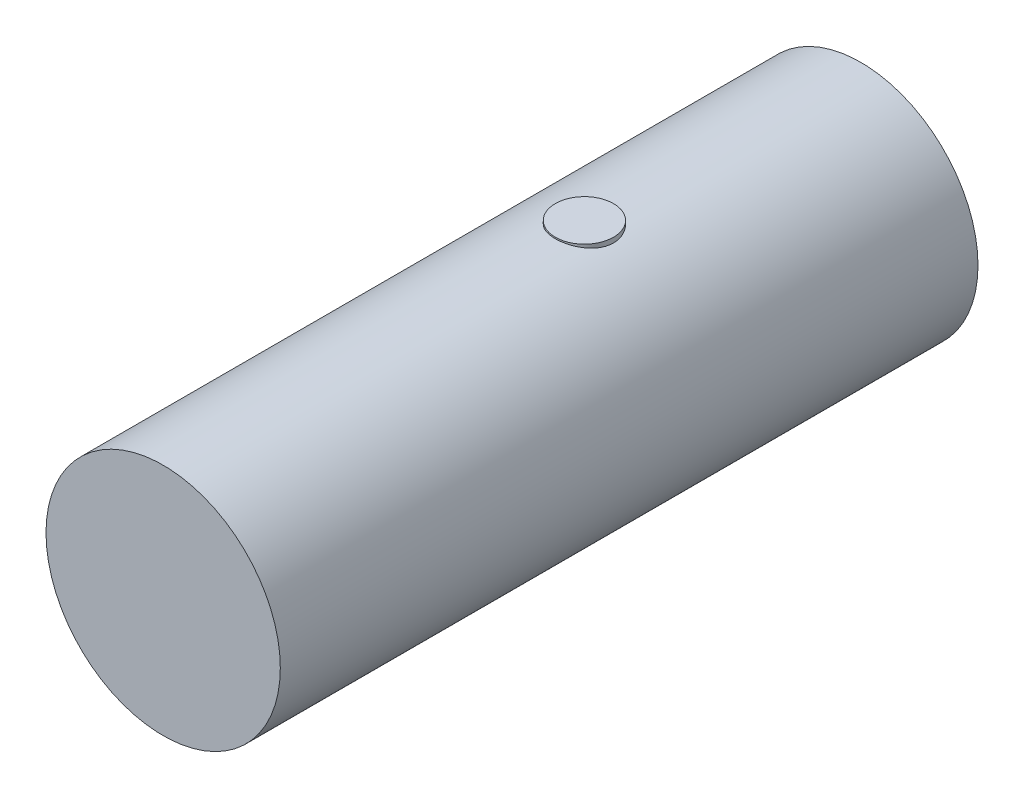
ISO-10303-21;
HEADER;
FILE_DESCRIPTION(('STEP AP214'),'2;1');
FILE_NAME('part.step','',(''),(''),'','','');
FILE_SCHEMA(('AUTOMOTIVE_DESIGN { 1 0 10303 214 1 1 1 1 }'));
ENDSEC;
DATA;
#1=APPLICATION_CONTEXT('core data for automotive mechanical design processes');
#2=APPLICATION_PROTOCOL_DEFINITION('international standard','automotive_design',2000,#1);
#3=PRODUCT_CONTEXT('',#1,'mechanical');
#4=PRODUCT('Part','Part','',(#3));
#5=PRODUCT_RELATED_PRODUCT_CATEGORY('part','',(#4));
#6=PRODUCT_DEFINITION_FORMATION('','',#4);
#7=PRODUCT_DEFINITION_CONTEXT('part definition',#1,'design');
#8=PRODUCT_DEFINITION('design','',#6,#7);
#9=PRODUCT_DEFINITION_SHAPE('','',#8);
#10=(LENGTH_UNIT() NAMED_UNIT(*) SI_UNIT(.MILLI.,.METRE.));
#11=(NAMED_UNIT(*) PLANE_ANGLE_UNIT() SI_UNIT($,.RADIAN.));
#12=(NAMED_UNIT(*) SI_UNIT($,.STERADIAN.) SOLID_ANGLE_UNIT());
#13=UNCERTAINTY_MEASURE_WITH_UNIT(LENGTH_MEASURE(1.E-05),#10,'distance_accuracy_value','');
#14=(GEOMETRIC_REPRESENTATION_CONTEXT(3) GLOBAL_UNCERTAINTY_ASSIGNED_CONTEXT((#13)) GLOBAL_UNIT_ASSIGNED_CONTEXT((#10,
#11,#12)) REPRESENTATION_CONTEXT('',''));
#15=CARTESIAN_POINT('',(0.,0.,0.));
#16=DIRECTION('',(0.,0.,1.));
#17=DIRECTION('',(1.,0.,0.));
#18=AXIS2_PLACEMENT_3D('',#15,#16,#17);
#19=CARTESIAN_POINT('',(0.,0.,530.));
#20=DIRECTION('',(0.,0.,-1.));
#21=DIRECTION('',(-1.,0.,0.));
#22=AXIS2_PLACEMENT_3D('',#19,#20,#21);
#23=CYLINDRICAL_SURFACE('',#22,89.);
#24=CARTESIAN_POINT('',(0.,-89.,232.126613263415));
#25=CARTESIAN_POINT('',(0.611417434861091,-88.9999985464395,232.126610655086));
#26=CARTESIAN_POINT('',(1.22288743460139,-88.9936837681099,232.101249222252));
#27=CARTESIAN_POINT('',(2.44141315504864,-88.9685956655376,232.000008801114));
#28=CARTESIAN_POINT('',(3.04846835638634,-88.9498208986903,231.924123963259));
#29=CARTESIAN_POINT('',(4.25405471726369,-88.9003215166107,231.722424753461));
#30=CARTESIAN_POINT('',(4.85258133373354,-88.869590762381,231.596584730533));
#31=CARTESIAN_POINT('',(6.03651638128265,-88.7970283616154,231.296020797543));
#32=CARTESIAN_POINT('',(6.62192515325351,-88.7551970039129,231.121298159382));
#33=CARTESIAN_POINT('',(7.77488875315297,-88.6616335104024,230.724607350051));
#34=CARTESIAN_POINT('',(8.34246429320112,-88.6099133950601,230.502696503033));
#35=CARTESIAN_POINT('',(9.45668604219615,-88.4979358023704,230.013205379721));
#36=CARTESIAN_POINT('',(10.0033321378509,-88.4376782788179,229.745624856256));
#37=CARTESIAN_POINT('',(11.0721153941217,-88.3102368754896,229.16675838308));
#38=CARTESIAN_POINT('',(11.5942525985915,-88.2430530081078,228.855472511574));
#39=CARTESIAN_POINT('',(12.6106869916732,-88.1035400960233,228.191375633268));
#40=CARTESIAN_POINT('',(13.1049838002433,-88.0312109811148,227.838564059815));
#41=CARTESIAN_POINT('',(14.0713941211849,-87.8819623826407,227.086966202677));
#42=CARTESIAN_POINT('',(14.5429360038649,-87.8049831108575,226.687456619688));
#43=CARTESIAN_POINT('',(15.4508605077163,-87.6497750771878,225.850524707632));
#44=CARTESIAN_POINT('',(15.8872427170871,-87.5715463006795,225.41310193464));
#45=CARTESIAN_POINT('',(16.7220318332209,-87.4159824369374,224.503169078655));
#46=CARTESIAN_POINT('',(17.1204346733401,-87.3386474461831,224.030655247899));
#47=CARTESIAN_POINT('',(17.8765429426203,-87.1870284807439,223.05365046192));
#48=CARTESIAN_POINT('',(18.2342481446576,-87.1127445230876,222.549159328263));
#49=CARTESIAN_POINT('',(18.911428050633,-86.9682675578958,221.503842151709));
#50=CARTESIAN_POINT('',(19.2302629561356,-86.8981508054627,220.962590774654));
#51=CARTESIAN_POINT('',(19.8210952025673,-86.765292169646,219.854216953611));
#52=CARTESIAN_POINT('',(20.0930919593525,-86.7025503782426,219.287094187077));
#53=CARTESIAN_POINT('',(20.5880813963424,-86.5863475188598,218.13100537767));
#54=CARTESIAN_POINT('',(20.8110800980383,-86.5328853106596,217.542042029246));
#55=CARTESIAN_POINT('',(21.2062736732786,-86.4368865631239,216.346443852668));
#56=CARTESIAN_POINT('',(21.3784697492819,-86.3943497651955,215.739809443147));
#57=CARTESIAN_POINT('',(21.6676830194959,-86.3222642012681,214.52551790948));
#58=CARTESIAN_POINT('',(21.7857262865733,-86.2924747055667,213.918119398327));
#59=CARTESIAN_POINT('',(21.9705710196255,-86.2455977482143,212.695087394667));
#60=CARTESIAN_POINT('',(22.0373731002468,-86.2285101342022,212.07945400103));
#61=CARTESIAN_POINT('',(22.1191425230928,-86.2075711481196,210.844616115627));
#62=CARTESIAN_POINT('',(22.1341171394841,-86.2037179185573,210.225412137226));
#63=CARTESIAN_POINT('',(22.112118039662,-86.2093635819393,208.987993617343));
#64=CARTESIAN_POINT('',(22.0751450364657,-86.2188622916189,208.369779062398));
#65=CARTESIAN_POINT('',(21.951090126737,-86.2505280996375,207.15373857625));
#66=CARTESIAN_POINT('',(21.8652314939444,-86.2723858463712,206.555779295858));
#67=CARTESIAN_POINT('',(21.6450619955579,-86.3278875035567,205.369419251939));
#68=CARTESIAN_POINT('',(21.5107520206519,-86.3615311973455,204.781018312907));
#69=CARTESIAN_POINT('',(21.1947565598354,-86.439624866144,203.617792311913));
#70=CARTESIAN_POINT('',(21.013068784095,-86.4840753634533,203.042967907587));
#71=CARTESIAN_POINT('',(20.6037306640839,-86.5825072101249,201.910768046961));
#72=CARTESIAN_POINT('',(20.3760796033595,-86.6364887080501,201.353392862806));
#73=CARTESIAN_POINT('',(19.8740115526652,-86.7530443315757,200.254264817393));
#74=CARTESIAN_POINT('',(19.5991505862468,-86.8156988219588,199.712723335218));
#75=CARTESIAN_POINT('',(19.0062535263092,-86.9474237711596,198.654643183366));
#76=CARTESIAN_POINT('',(18.6882172745292,-87.0164942534951,198.138104605347));
#77=CARTESIAN_POINT('',(18.0111102695676,-87.1591623645107,197.133219411987));
#78=CARTESIAN_POINT('',(17.6520335786747,-87.2327606475579,196.64487689146));
#79=CARTESIAN_POINT('',(16.8952542730158,-87.3824875471304,195.699509571177));
#80=CARTESIAN_POINT('',(16.4975509270525,-87.4586162115376,195.242485364552));
#81=CARTESIAN_POINT('',(15.6543260663337,-87.6135316157466,194.350193896755));
#82=CARTESIAN_POINT('',(15.2077719941065,-87.6923327498429,193.91590428975));
#83=CARTESIAN_POINT('',(14.2794800342811,-87.8482664510687,193.086368124101));
#84=CARTESIAN_POINT('',(13.7977414670952,-87.925398985932,192.691122319935));
#85=CARTESIAN_POINT('',(12.8022439233613,-88.0758532184272,191.942384564908));
#86=CARTESIAN_POINT('',(12.2884837174746,-88.1491747695537,191.588894218586));
#87=CARTESIAN_POINT('',(11.2323792533329,-88.2899620598654,190.926214649872));
#88=CARTESIAN_POINT('',(10.6900351682944,-88.3574278345298,190.617025159062));
#89=CARTESIAN_POINT('',(9.57854222481054,-88.4848317464139,190.04428100261));
#90=CARTESIAN_POINT('',(9.00930852040471,-88.5447435169379,189.780885026712));
#91=CARTESIAN_POINT('',(7.8497307339622,-88.6550668537858,189.303093008115));
#92=CARTESIAN_POINT('',(7.25938653512886,-88.7054783675386,189.088697236564));
#93=CARTESIAN_POINT('',(6.06193190185515,-88.7953455050926,188.710704033592));
#94=CARTESIAN_POINT('',(5.45482406300313,-88.8348028146389,188.547098785546));
#95=CARTESIAN_POINT('',(4.22825434503127,-88.9016256195665,188.272048390778));
#96=CARTESIAN_POINT('',(3.60879276728345,-88.9289914095467,188.16060197325));
#97=CARTESIAN_POINT('',(2.37800472643793,-88.9703017423091,187.993000604266));
#98=CARTESIAN_POINT('',(1.76686982341464,-88.9845687753807,187.935516261018));
#99=CARTESIAN_POINT('',(0.54177684699349,-89.0004591077316,187.871518138259));
#100=CARTESIAN_POINT('',(-0.0721811785695423,-89.0020826204579,187.865003498283));
#101=CARTESIAN_POINT('',(-1.29836494992996,-88.992640906152,187.902998340364));
#102=CARTESIAN_POINT('',(-1.91059083360668,-88.9815767192794,187.947503639719));
#103=CARTESIAN_POINT('',(-3.12888359218599,-88.9470710514266,188.087149147428));
#104=CARTESIAN_POINT('',(-3.73495049074009,-88.9236296179953,188.182289161262));
#105=CARTESIAN_POINT('',(-4.92772605698617,-88.8654535995452,188.420635208506));
#106=CARTESIAN_POINT('',(-5.51458827550595,-88.8308897038279,188.563115748957));
#107=CARTESIAN_POINT('',(-6.67404612553227,-88.7513087042272,188.895313411772));
#108=CARTESIAN_POINT('',(-7.24664193889435,-88.706291733666,189.085029931674));
#109=CARTESIAN_POINT('',(-8.37377928624138,-88.6069972239677,189.510254167913));
#110=CARTESIAN_POINT('',(-8.92831949347093,-88.5527190061196,189.745765240483));
#111=CARTESIAN_POINT('',(-10.0156972910269,-88.4363321469712,190.260831727214));
#112=CARTESIAN_POINT('',(-10.548534484034,-88.3742233624012,190.54038794726));
#113=CARTESIAN_POINT('',(-11.5982735811343,-88.2426472316362,191.1468587965));
#114=CARTESIAN_POINT('',(-12.1147305304732,-88.1730696968033,191.474519734692));
#115=CARTESIAN_POINT('',(-13.1183406142375,-88.0293483360057,192.171110807962));
#116=CARTESIAN_POINT('',(-13.6054934663233,-87.9552044660591,192.540041340566));
#117=CARTESIAN_POINT('',(-14.5474687053752,-87.8043207984268,193.31674880735));
#118=CARTESIAN_POINT('',(-15.0022862726888,-87.7275806162599,193.724531511431));
#119=CARTESIAN_POINT('',(-15.8766236817421,-87.5735686099468,194.576241714696));
#120=CARTESIAN_POINT('',(-16.2961430184845,-87.4962967782116,195.020169730818));
#121=CARTESIAN_POINT('',(-17.1069145745708,-87.3414446953515,195.952532421476));
#122=CARTESIAN_POINT('',(-17.4972328041388,-87.2639025337404,196.441786178958));
#123=CARTESIAN_POINT('',(-18.2352921494787,-87.1126631522638,197.451993901754));
#124=CARTESIAN_POINT('',(-18.5830324971412,-87.0389660017765,197.972948438699));
#125=CARTESIAN_POINT('',(-19.2334170101124,-86.8975630732369,199.043052677273));
#126=CARTESIAN_POINT('',(-19.5360622439637,-86.829857153236,199.59220171041));
#127=CARTESIAN_POINT('',(-20.0939763917067,-86.702445423953,200.714954519057));
#128=CARTESIAN_POINT('',(-20.3492459597414,-86.6427395042133,201.288557956778));
#129=CARTESIAN_POINT('',(-20.8090024060997,-86.5334672706484,202.45270089381));
#130=CARTESIAN_POINT('',(-21.0137848412828,-86.4838422586432,203.043118101858));
#131=CARTESIAN_POINT('',(-21.3728572547732,-86.395805392065,204.239939268099));
#132=CARTESIAN_POINT('',(-21.5271473053564,-86.3573935214412,204.846343203407));
#133=CARTESIAN_POINT('',(-21.7838855369324,-86.2929885636362,206.070568545167));
#134=CARTESIAN_POINT('',(-21.8863431056196,-86.2669932276688,206.688387863085));
#135=CARTESIAN_POINT('',(-22.0385464293128,-86.2282359219173,207.930893097602));
#136=CARTESIAN_POINT('',(-22.0882934353954,-86.2154736380491,208.555578850873));
#137=CARTESIAN_POINT('',(-22.1339720114701,-86.2037574264758,209.789243764008));
#138=CARTESIAN_POINT('',(-22.1313931147288,-86.204421301738,210.398164640439));
#139=CARTESIAN_POINT('',(-22.0760836605448,-86.2186020947281,211.6135647646));
#140=CARTESIAN_POINT('',(-22.0233541064955,-86.232118755303,212.220044060937));
#141=CARTESIAN_POINT('',(-21.8681966519183,-86.2715964859137,213.42617857514));
#142=CARTESIAN_POINT('',(-21.7657700514054,-86.2975572304271,214.02583397109));
#143=CARTESIAN_POINT('',(-21.5120753316171,-86.3611468624113,215.21408794623));
#144=CARTESIAN_POINT('',(-21.3608069680711,-86.3987758082379,215.802686470107));
#145=CARTESIAN_POINT('',(-21.01168073218,-86.4843416084374,216.961339406696));
#146=CARTESIAN_POINT('',(-20.8141008443565,-86.5322168161991,217.53148222159));
#147=CARTESIAN_POINT('',(-20.3734006370196,-86.6370348473963,218.653009730783));
#148=CARTESIAN_POINT('',(-20.1302806380504,-86.6939776070076,219.204394557082));
#149=CARTESIAN_POINT('',(-19.6002524638716,-86.8153441582177,220.284905006459));
#150=CARTESIAN_POINT('',(-19.313339672779,-86.8797687382501,220.814028275599));
#151=CARTESIAN_POINT('',(-18.6977457359307,-87.014329453877,221.846630233974));
#152=CARTESIAN_POINT('',(-18.3690637092586,-87.0844657099201,222.350108382037));
#153=CARTESIAN_POINT('',(-17.6631201643739,-87.2304269625012,223.340941095568));
#154=CARTESIAN_POINT('',(-17.284823348668,-87.3063520908379,223.827543564187));
#155=CARTESIAN_POINT('',(-16.4891389705137,-87.4601191479664,224.767342819534));
#156=CARTESIAN_POINT('',(-16.0717507153964,-87.5379611107048,225.220539014075));
#157=CARTESIAN_POINT('',(-15.2005280167786,-87.6934418480589,226.090683270423));
#158=CARTESIAN_POINT('',(-14.7466852140694,-87.7710805718322,226.507622972527));
#159=CARTESIAN_POINT('',(-13.8055797403787,-87.9240194337534,227.302378861337));
#160=CARTESIAN_POINT('',(-13.3183171030074,-87.9993195742532,227.680195087389));
#161=CARTESIAN_POINT('',(-12.3045260831607,-88.1468412901257,228.4005211744));
#162=CARTESIAN_POINT('',(-11.7774513686129,-88.2189837382904,228.742278892054));
#163=CARTESIAN_POINT('',(-10.695478859097,-88.3566867459989,229.380095968583));
#164=CARTESIAN_POINT('',(-10.1405797508018,-88.4222469944199,229.676153167674));
#165=CARTESIAN_POINT('',(-9.00719553077256,-88.5448762288423,230.220096780709));
#166=CARTESIAN_POINT('',(-8.42872587950575,-88.6019506701904,230.46801417437));
#167=CARTESIAN_POINT('',(-7.25201807773625,-88.7060138125369,230.913894034629));
#168=CARTESIAN_POINT('',(-6.65378295108209,-88.7530040481123,231.111864102833));
#169=CARTESIAN_POINT('',(-5.55755064958974,-88.8276724042279,231.423365662677));
#170=CARTESIAN_POINT('',(-5.06219584908493,-88.8573244973256,231.545800256747));
#171=CARTESIAN_POINT('',(-4.06366430078431,-88.9085852730814,231.756240509856));
#172=CARTESIAN_POINT('',(-3.56048567635049,-88.9301919939604,231.844237771983));
#173=CARTESIAN_POINT('',(-2.54898676628381,-88.9649297673758,231.985231817649));
#174=CARTESIAN_POINT('',(-2.04066678288247,-88.9780613152122,232.038230646549));
#175=CARTESIAN_POINT('',(-1.02157631844121,-88.9955959129651,232.10891790488));
#176=CARTESIAN_POINT('',(-0.510806503593662,-89.000001214372,232.126615442534));
#177=CARTESIAN_POINT('',(0.,-89.,232.126613263415));
#178=B_SPLINE_CURVE_WITH_KNOTS('',3,(#24,#25,#26,#27,#28,#29,#30,#31,#32,#33,#34,#35,#36,#37,
#38,#39,#40,#41,#42,#43,#44,#45,#46,#47,#48,#49,#50,#51,#52,#53,#54,#55,#56,#57,#58,#59,#60,#61,
#62,#63,#64,#65,#66,#67,#68,#69,#70,#71,#72,#73,#74,#75,#76,#77,#78,#79,#80,#81,#82,#83,#84,#85,
#86,#87,#88,#89,#90,#91,#92,#93,#94,#95,#96,#97,#98,#99,#100,#101,#102,#103,#104,#105,#106,#107,
#108,#109,#110,#111,#112,#113,#114,#115,#116,#117,#118,#119,#120,#121,#122,#123,#124,#125,#126,
#127,#128,#129,#130,#131,#132,#133,#134,#135,#136,#137,#138,#139,#140,#141,#142,#143,#144,#145,
#146,#147,#148,#149,#150,#151,#152,#153,#154,#155,#156,#157,#158,#159,#160,#161,#162,#163,#164,
#165,#166,#167,#168,#169,#170,#171,#172,#173,#174,#175,#176,#177),.UNSPECIFIED.,.T.,.F.,(4,2,2,
2,2,2,2,2,2,2,2,2,2,2,2,2,2,2,2,2,2,2,2,2,2,2,2,2,2,2,2,2,2,2,2,2,2,2,2,2,2,2,2,2,2,2,2,2,2,2,2,
2,2,2,2,2,2,2,2,2,2,2,2,2,2,2,2,2,2,2,2,2,2,2,2,2,4),(0.,1.83378687242753,3.66778609582948,
5.50272826161909,7.33762268759117,9.17030069268053,11.0029886167505,12.8356732614777,
14.6683829176345,16.5346375452216,18.4009140277756,20.2673901180967,22.1338766242558,
24.0278201457411,25.9217872859143,27.8155215414831,29.709210970232,31.5653646692888,
33.421496103134,35.2773670118478,37.1332124476991,38.9445403565847,40.7558349692707,
42.5672171403793,44.3786275486287,46.2081126842626,48.0376045261354,49.8673613938798,
51.6971529054175,53.5785701092764,55.4600236622676,57.3415494904427,59.2230639180001,
61.1109738040245,62.9988941367814,64.8865237757614,66.774107421821,68.613864735329,
70.4535909901243,72.2931664317517,74.132734806441,75.9453207108955,77.7578834982705,
79.570579176498,81.3833080250299,83.2279117377975,85.0725332201355,86.9174290738336,
88.7623513172186,90.6520815399998,92.5418458486913,94.4315653717172,96.3212588003674,
98.1996120715786,100.077962654065,101.955972915203,103.833938601076,105.658522224209,
107.483069342604,109.307568735616,111.132077253578,112.945902620997,114.759715221885,
116.573719135898,118.387761313747,120.248647700266,122.109567066434,123.97091437554,
125.832259812719,127.726889147686,129.621607994571,131.515103450224,133.408310556109,
134.940452879495,136.47296855533,138.005394660824,139.53742532798),.UNSPECIFIED.);
#179=CARTESIAN_POINT('',(0.,-89.,232.126613263415));
#180=VERTEX_POINT('',#179);
#181=EDGE_CURVE('E36',#180,#180,#178,.T.);
#182=ORIENTED_EDGE('',*,*,#181,.T.);
#183=EDGE_LOOP('',(#182));
#184=FACE_BOUND('',#183,.T.);
#185=CARTESIAN_POINT('',(0.,89.,232.126613263415));
#186=CARTESIAN_POINT('',(-0.61141743486104,88.9999985464394,232.126610655086));
#187=CARTESIAN_POINT('',(-1.22288743460134,88.9936837681099,232.101249222252));
#188=CARTESIAN_POINT('',(-2.44141315504859,88.9685956655376,232.000008801114));
#189=CARTESIAN_POINT('',(-3.04846835638629,88.9498208986903,231.924123963259));
#190=CARTESIAN_POINT('',(-4.25405471726364,88.9003215166107,231.722424753461));
#191=CARTESIAN_POINT('',(-4.85258133373349,88.869590762381,231.596584730533));
#192=CARTESIAN_POINT('',(-6.0365163812826,88.7970283616154,231.296020797543));
#193=CARTESIAN_POINT('',(-6.62192515325346,88.7551970039129,231.121298159382));
#194=CARTESIAN_POINT('',(-7.77488875315292,88.6616335104024,230.724607350051));
#195=CARTESIAN_POINT('',(-8.34246429320107,88.6099133950601,230.502696503033));
#196=CARTESIAN_POINT('',(-9.45668604219609,88.4979358023704,230.013205379721));
#197=CARTESIAN_POINT('',(-10.0033321378508,88.4376782788179,229.745624856256));
#198=CARTESIAN_POINT('',(-11.0721153941217,88.3102368754896,229.16675838308));
#199=CARTESIAN_POINT('',(-11.5942525985914,88.2430530081078,228.855472511574));
#200=CARTESIAN_POINT('',(-12.6106869916732,88.1035400960233,228.191375633268));
#201=CARTESIAN_POINT('',(-13.1049838002433,88.0312109811148,227.838564059815));
#202=CARTESIAN_POINT('',(-14.0713941211849,87.8819623826407,227.086966202677));
#203=CARTESIAN_POINT('',(-14.5429360038648,87.8049831108575,226.687456619688));
#204=CARTESIAN_POINT('',(-15.4508605077163,87.6497750771878,225.850524707632));
#205=CARTESIAN_POINT('',(-15.887242717087,87.5715463006795,225.41310193464));
#206=CARTESIAN_POINT('',(-16.7220318332208,87.4159824369374,224.503169078655));
#207=CARTESIAN_POINT('',(-17.1204346733401,87.3386474461832,224.030655247899));
#208=CARTESIAN_POINT('',(-17.8765429426203,87.187028480744,223.05365046192));
#209=CARTESIAN_POINT('',(-18.2342481446576,87.1127445230876,222.549159328263));
#210=CARTESIAN_POINT('',(-18.9114280506329,86.9682675578958,221.503842151709));
#211=CARTESIAN_POINT('',(-19.2302629561355,86.8981508054627,220.962590774654));
#212=CARTESIAN_POINT('',(-19.8210952025673,86.765292169646,219.854216953611));
#213=CARTESIAN_POINT('',(-20.0930919593524,86.7025503782426,219.287094187077));
#214=CARTESIAN_POINT('',(-20.5880813963424,86.5863475188599,218.13100537767));
#215=CARTESIAN_POINT('',(-20.8110800980383,86.5328853106596,217.542042029246));
#216=CARTESIAN_POINT('',(-21.2062736732786,86.4368865631239,216.346443852668));
#217=CARTESIAN_POINT('',(-21.3784697492819,86.3943497651955,215.739809443147));
#218=CARTESIAN_POINT('',(-21.6676830194959,86.3222642012681,214.52551790948));
#219=CARTESIAN_POINT('',(-21.7857262865732,86.2924747055667,213.918119398327));
#220=CARTESIAN_POINT('',(-21.9705710196255,86.2455977482143,212.695087394667));
#221=CARTESIAN_POINT('',(-22.0373731002468,86.2285101342022,212.07945400103));
#222=CARTESIAN_POINT('',(-22.1191425230927,86.2075711481196,210.844616115627));
#223=CARTESIAN_POINT('',(-22.134117139484,86.2037179185573,210.225412137226));
#224=CARTESIAN_POINT('',(-22.112118039662,86.2093635819393,208.987993617343));
#225=CARTESIAN_POINT('',(-22.0751450364656,86.2188622916189,208.369779062398));
#226=CARTESIAN_POINT('',(-21.9510901267369,86.2505280996375,207.15373857625));
#227=CARTESIAN_POINT('',(-21.8652314939443,86.2723858463712,206.555779295858));
#228=CARTESIAN_POINT('',(-21.6450619955579,86.3278875035567,205.369419251939));
#229=CARTESIAN_POINT('',(-21.5107520206519,86.3615311973455,204.781018312907));
#230=CARTESIAN_POINT('',(-21.1947565598354,86.439624866144,203.617792311913));
#231=CARTESIAN_POINT('',(-21.0130687840949,86.4840753634533,203.042967907587));
#232=CARTESIAN_POINT('',(-20.6037306640838,86.5825072101249,201.910768046961));
#233=CARTESIAN_POINT('',(-20.3760796033595,86.6364887080502,201.353392862806));
#234=CARTESIAN_POINT('',(-19.8740115526652,86.7530443315757,200.254264817393));
#235=CARTESIAN_POINT('',(-19.5991505862467,86.8156988219588,199.712723335218));
#236=CARTESIAN_POINT('',(-19.0062535263091,86.9474237711596,198.654643183366));
#237=CARTESIAN_POINT('',(-18.6882172745292,87.0164942534951,198.138104605347));
#238=CARTESIAN_POINT('',(-18.0111102695676,87.1591623645107,197.133219411987));
#239=CARTESIAN_POINT('',(-17.6520335786747,87.2327606475579,196.64487689146));
#240=CARTESIAN_POINT('',(-16.8952542730157,87.3824875471304,195.699509571177));
#241=CARTESIAN_POINT('',(-16.4975509270525,87.4586162115376,195.242485364552));
#242=CARTESIAN_POINT('',(-15.6543260663336,87.6135316157466,194.350193896755));
#243=CARTESIAN_POINT('',(-15.2077719941065,87.6923327498429,193.91590428975));
#244=CARTESIAN_POINT('',(-14.279480034281,87.8482664510688,193.086368124101));
#245=CARTESIAN_POINT('',(-13.7977414670952,87.925398985932,192.691122319935));
#246=CARTESIAN_POINT('',(-12.8022439233613,88.0758532184272,191.942384564908));
#247=CARTESIAN_POINT('',(-12.2884837174746,88.1491747695537,191.588894218586));
#248=CARTESIAN_POINT('',(-11.2323792533329,88.2899620598655,190.926214649872));
#249=CARTESIAN_POINT('',(-10.6900351682944,88.3574278345298,190.617025159062));
#250=CARTESIAN_POINT('',(-9.57854222481049,88.4848317464139,190.04428100261));
#251=CARTESIAN_POINT('',(-9.00930852040466,88.5447435169379,189.780885026712));
#252=CARTESIAN_POINT('',(-7.84973073396215,88.6550668537858,189.303093008115));
#253=CARTESIAN_POINT('',(-7.25938653512882,88.7054783675386,189.088697236564));
#254=CARTESIAN_POINT('',(-6.06193190185511,88.7953455050925,188.710704033592));
#255=CARTESIAN_POINT('',(-5.45482406300308,88.8348028146389,188.547098785546));
#256=CARTESIAN_POINT('',(-4.22825434503122,88.9016256195665,188.272048390778));
#257=CARTESIAN_POINT('',(-3.6087927672834,88.9289914095467,188.16060197325));
#258=CARTESIAN_POINT('',(-2.37800472643788,88.9703017423091,187.993000604266));
#259=CARTESIAN_POINT('',(-1.76686982341458,88.9845687753807,187.935516261018));
#260=CARTESIAN_POINT('',(-0.541776846993433,89.0004591077316,187.871518138259));
#261=CARTESIAN_POINT('',(0.0721811785695968,89.0020826204579,187.865003498283));
#262=CARTESIAN_POINT('',(1.29836494993002,88.992640906152,187.902998340364));
#263=CARTESIAN_POINT('',(1.91059083360673,88.9815767192794,187.947503639719));
#264=CARTESIAN_POINT('',(3.12888359218604,88.9470710514266,188.087149147428));
#265=CARTESIAN_POINT('',(3.73495049074014,88.9236296179953,188.182289161262));
#266=CARTESIAN_POINT('',(4.92772605698622,88.8654535995452,188.420635208506));
#267=CARTESIAN_POINT('',(5.514588275506,88.8308897038279,188.563115748957));
#268=CARTESIAN_POINT('',(6.67404612553232,88.7513087042272,188.895313411772));
#269=CARTESIAN_POINT('',(7.2466419388944,88.7062917336661,189.085029931674));
#270=CARTESIAN_POINT('',(8.37377928624143,88.6069972239677,189.510254167913));
#271=CARTESIAN_POINT('',(8.92831949347099,88.5527190061196,189.745765240483));
#272=CARTESIAN_POINT('',(10.0156972910269,88.4363321469712,190.260831727214));
#273=CARTESIAN_POINT('',(10.548534484034,88.3742233624011,190.54038794726));
#274=CARTESIAN_POINT('',(11.5982735811343,88.2426472316362,191.1468587965));
#275=CARTESIAN_POINT('',(12.1147305304733,88.1730696968033,191.474519734692));
#276=CARTESIAN_POINT('',(13.1183406142376,88.0293483360057,192.171110807962));
#277=CARTESIAN_POINT('',(13.6054934663234,87.9552044660591,192.540041340566));
#278=CARTESIAN_POINT('',(14.5474687053753,87.8043207984268,193.31674880735));
#279=CARTESIAN_POINT('',(15.0022862726889,87.7275806162599,193.724531511431));
#280=CARTESIAN_POINT('',(15.8766236817422,87.5735686099468,194.576241714696));
#281=CARTESIAN_POINT('',(16.2961430184845,87.4962967782116,195.020169730818));
#282=CARTESIAN_POINT('',(17.1069145745709,87.3414446953515,195.952532421476));
#283=CARTESIAN_POINT('',(17.4972328041388,87.2639025337404,196.441786178958));
#284=CARTESIAN_POINT('',(18.2352921494787,87.1126631522638,197.451993901754));
#285=CARTESIAN_POINT('',(18.5830324971412,87.0389660017764,197.972948438699));
#286=CARTESIAN_POINT('',(19.2334170101125,86.8975630732368,199.043052677273));
#287=CARTESIAN_POINT('',(19.5360622439637,86.829857153236,199.59220171041));
#288=CARTESIAN_POINT('',(20.0939763917068,86.702445423953,200.714954519057));
#289=CARTESIAN_POINT('',(20.3492459597414,86.6427395042133,201.288557956778));
#290=CARTESIAN_POINT('',(20.8090024060997,86.5334672706483,202.45270089381));
#291=CARTESIAN_POINT('',(21.0137848412828,86.4838422586432,203.043118101858));
#292=CARTESIAN_POINT('',(21.3728572547733,86.395805392065,204.239939268099));
#293=CARTESIAN_POINT('',(21.5271473053565,86.3573935214412,204.846343203407));
#294=CARTESIAN_POINT('',(21.7838855369324,86.2929885636361,206.070568545167));
#295=CARTESIAN_POINT('',(21.8863431056197,86.2669932276688,206.688387863085));
#296=CARTESIAN_POINT('',(22.0385464293129,86.2282359219173,207.930893097602));
#297=CARTESIAN_POINT('',(22.0882934353954,86.215473638049,208.555578850873));
#298=CARTESIAN_POINT('',(22.1339720114702,86.2037574264758,209.789243764008));
#299=CARTESIAN_POINT('',(22.1313931147288,86.204421301738,210.398164640439));
#300=CARTESIAN_POINT('',(22.0760836605448,86.2186020947281,211.6135647646));
#301=CARTESIAN_POINT('',(22.0233541064956,86.232118755303,212.220044060937));
#302=CARTESIAN_POINT('',(21.8681966519184,86.2715964859137,213.42617857514));
#303=CARTESIAN_POINT('',(21.7657700514054,86.2975572304271,214.02583397109));
#304=CARTESIAN_POINT('',(21.5120753316172,86.3611468624113,215.21408794623));
#305=CARTESIAN_POINT('',(21.3608069680712,86.3987758082378,215.802686470107));
#306=CARTESIAN_POINT('',(21.0116807321801,86.4843416084374,216.961339406696));
#307=CARTESIAN_POINT('',(20.8141008443566,86.5322168161991,217.53148222159));
#308=CARTESIAN_POINT('',(20.3734006370197,86.6370348473963,218.653009730783));
#309=CARTESIAN_POINT('',(20.1302806380504,86.6939776070076,219.204394557082));
#310=CARTESIAN_POINT('',(19.6002524638716,86.8153441582177,220.284905006459));
#311=CARTESIAN_POINT('',(19.313339672779,86.8797687382501,220.814028275599));
#312=CARTESIAN_POINT('',(18.6977457359308,87.014329453877,221.846630233974));
#313=CARTESIAN_POINT('',(18.3690637092587,87.08446570992,222.350108382037));
#314=CARTESIAN_POINT('',(17.663120164374,87.2304269625012,223.340941095568));
#315=CARTESIAN_POINT('',(17.2848233486681,87.3063520908379,223.827543564187));
#316=CARTESIAN_POINT('',(16.4891389705138,87.4601191479664,224.767342819534));
#317=CARTESIAN_POINT('',(16.0717507153965,87.5379611107049,225.220539014075));
#318=CARTESIAN_POINT('',(15.2005280167786,87.6934418480589,226.090683270423));
#319=CARTESIAN_POINT('',(14.7466852140695,87.7710805718321,226.507622972527));
#320=CARTESIAN_POINT('',(13.8055797403787,87.9240194337534,227.302378861337));
#321=CARTESIAN_POINT('',(13.3183171030075,87.9993195742532,227.680195087389));
#322=CARTESIAN_POINT('',(12.3045260831608,88.1468412901257,228.4005211744));
#323=CARTESIAN_POINT('',(11.777451368613,88.2189837382904,228.742278892054));
#324=CARTESIAN_POINT('',(10.6954788590971,88.3566867459989,229.380095968583));
#325=CARTESIAN_POINT('',(10.1405797508019,88.4222469944199,229.676153167674));
#326=CARTESIAN_POINT('',(9.00719553077265,88.5448762288422,230.220096780709));
#327=CARTESIAN_POINT('',(8.42872587950584,88.6019506701904,230.46801417437));
#328=CARTESIAN_POINT('',(7.25201807773633,88.7060138125369,230.913894034629));
#329=CARTESIAN_POINT('',(6.65378295108217,88.7530040481123,231.111864102833));
#330=CARTESIAN_POINT('',(5.55755064958982,88.8276724042279,231.423365662677));
#331=CARTESIAN_POINT('',(5.06219584908501,88.8573244973256,231.545800256747));
#332=CARTESIAN_POINT('',(4.06366430078439,88.9085852730814,231.756240509856));
#333=CARTESIAN_POINT('',(3.56048567635056,88.9301919939604,231.844237771983));
#334=CARTESIAN_POINT('',(2.54898676628389,88.9649297673758,231.985231817649));
#335=CARTESIAN_POINT('',(2.04066678288255,88.9780613152122,232.038230646549));
#336=CARTESIAN_POINT('',(1.02157631844128,88.9955959129651,232.10891790488));
#337=CARTESIAN_POINT('',(0.510806503593722,89.0000012143719,232.126615442534));
#338=CARTESIAN_POINT('',(0.,89.,232.126613263415));
#339=B_SPLINE_CURVE_WITH_KNOTS('',3,(#185,#186,#187,#188,#189,#190,#191,#192,#193,#194,#195,
#196,#197,#198,#199,#200,#201,#202,#203,#204,#205,#206,#207,#208,#209,#210,#211,#212,#213,#214,
#215,#216,#217,#218,#219,#220,#221,#222,#223,#224,#225,#226,#227,#228,#229,#230,#231,#232,#233,
#234,#235,#236,#237,#238,#239,#240,#241,#242,#243,#244,#245,#246,#247,#248,#249,#250,#251,#252,
#253,#254,#255,#256,#257,#258,#259,#260,#261,#262,#263,#264,#265,#266,#267,#268,#269,#270,#271,
#272,#273,#274,#275,#276,#277,#278,#279,#280,#281,#282,#283,#284,#285,#286,#287,#288,#289,#290,
#291,#292,#293,#294,#295,#296,#297,#298,#299,#300,#301,#302,#303,#304,#305,#306,#307,#308,#309,
#310,#311,#312,#313,#314,#315,#316,#317,#318,#319,#320,#321,#322,#323,#324,#325,#326,#327,#328,
#329,#330,#331,#332,#333,#334,#335,#336,#337,#338),.UNSPECIFIED.,.T.,.F.,(4,2,2,2,2,2,2,2,2,2,2,
2,2,2,2,2,2,2,2,2,2,2,2,2,2,2,2,2,2,2,2,2,2,2,2,2,2,2,2,2,2,2,2,2,2,2,2,2,2,2,2,2,2,2,2,2,2,2,2,
2,2,2,2,2,2,2,2,2,2,2,2,2,2,2,2,2,4),(0.,1.83378687242753,3.66778609582948,5.50272826161909,
7.33762268759117,9.17030069268052,11.0029886167505,12.8356732614777,14.6683829176345,
16.5346375452216,18.4009140277756,20.2673901180967,22.1338766242558,24.0278201457411,
25.9217872859143,27.8155215414831,29.709210970232,31.5653646692888,33.421496103134,
35.2773670118478,37.1332124476991,38.9445403565847,40.7558349692707,42.5672171403793,
44.3786275486287,46.2081126842625,48.0376045261354,49.8673613938798,51.6971529054176,
53.5785701092764,55.4600236622676,57.3415494904427,59.2230639180001,61.1109738040245,
62.9988941367814,64.8865237757614,66.774107421821,68.613864735329,70.4535909901243,
72.2931664317517,74.132734806441,75.9453207108955,77.7578834982705,79.570579176498,
81.3833080250299,83.2279117377975,85.0725332201355,86.9174290738336,88.7623513172187,
90.6520815399998,92.5418458486913,94.4315653717172,96.3212588003674,98.1996120715786,
100.077962654065,101.955972915203,103.833938601076,105.658522224209,107.483069342604,
109.307568735616,111.132077253578,112.945902620997,114.759715221885,116.573719135898,
118.387761313747,120.248647700266,122.109567066434,123.97091437554,125.832259812719,
127.726889147686,129.621607994571,131.515103450224,133.408310556109,134.940452879495,
136.47296855533,138.005394660824,139.53742532798),.UNSPECIFIED.);
#340=CARTESIAN_POINT('',(0.,89.,232.126613263415));
#341=VERTEX_POINT('',#340);
#342=EDGE_CURVE('E56',#341,#341,#339,.T.);
#343=ORIENTED_EDGE('',*,*,#342,.T.);
#344=EDGE_LOOP('',(#343));
#345=FACE_BOUND('',#344,.T.);
#346=CARTESIAN_POINT('',(0.,0.,530.));
#347=DIRECTION('',(0.,0.,1.));
#348=DIRECTION('',(1.,0.,0.));
#349=AXIS2_PLACEMENT_3D('',#346,#347,#348);
#350=CIRCLE('',#349,89.);
#351=CARTESIAN_POINT('',(89.,0.,530.));
#352=VERTEX_POINT('',#351);
#353=EDGE_CURVE('E10',#352,#352,#350,.T.);
#354=ORIENTED_EDGE('',*,*,#353,.F.);
#355=EDGE_LOOP('',(#354));
#356=FACE_BOUND('',#355,.T.);
#357=CARTESIAN_POINT('',(0.,0.,0.));
#358=DIRECTION('',(0.,0.,1.));
#359=DIRECTION('',(1.,0.,0.));
#360=AXIS2_PLACEMENT_3D('',#357,#358,#359);
#361=CIRCLE('',#360,89.);
#362=CARTESIAN_POINT('',(89.,0.,0.));
#363=VERTEX_POINT('',#362);
#364=EDGE_CURVE('E45',#363,#363,#361,.T.);
#365=ORIENTED_EDGE('',*,*,#364,.T.);
#366=EDGE_LOOP('',(#365));
#367=FACE_BOUND('',#366,.T.);
#368=ADVANCED_FACE('F32',(#184,#345,#356,#367),#23,.T.);
#369=CARTESIAN_POINT('',(0.,0.,530.));
#370=DIRECTION('',(0.,0.,1.));
#371=DIRECTION('',(1.,0.,0.));
#372=AXIS2_PLACEMENT_3D('',#369,#370,#371);
#373=PLANE('',#372);
#374=ORIENTED_EDGE('',*,*,#353,.T.);
#375=EDGE_LOOP('',(#374));
#376=FACE_BOUND('',#375,.T.);
#377=ADVANCED_FACE('F70',(#376),#373,.T.);
#378=CARTESIAN_POINT('',(0.,0.,0.));
#379=DIRECTION('',(0.,0.,1.));
#380=DIRECTION('',(1.,0.,0.));
#381=AXIS2_PLACEMENT_3D('',#378,#379,#380);
#382=PLANE('',#381);
#383=ORIENTED_EDGE('',*,*,#364,.F.);
#384=EDGE_LOOP('',(#383));
#385=FACE_BOUND('',#384,.T.);
#386=ADVANCED_FACE('F73',(#385),#382,.F.);
#387=CARTESIAN_POINT('',(0.,90.,210.));
#388=DIRECTION('',(0.,1.,0.));
#389=DIRECTION('',(0.,0.,1.));
#390=AXIS2_PLACEMENT_3D('',#387,#388,#389);
#391=PLANE('',#390);
#392=CARTESIAN_POINT('',(0.,90.,210.));
#393=DIRECTION('',(0.,1.,0.));
#394=DIRECTION('',(0.,0.,1.));
#395=AXIS2_PLACEMENT_3D('',#392,#393,#394);
#396=CIRCLE('',#395,22.1266132634148);
#397=CARTESIAN_POINT('',(0.,90.,232.126613263415));
#398=VERTEX_POINT('',#397);
#399=EDGE_CURVE('E99',#398,#398,#396,.T.);
#400=ORIENTED_EDGE('',*,*,#399,.T.);
#401=EDGE_LOOP('',(#400));
#402=FACE_BOUND('',#401,.T.);
#403=ADVANCED_FACE('F75',(#402),#391,.T.);
#404=CARTESIAN_POINT('',(0.,-90.,210.));
#405=DIRECTION('',(0.,1.,0.));
#406=DIRECTION('',(0.,0.,1.));
#407=AXIS2_PLACEMENT_3D('',#404,#405,#406);
#408=CYLINDRICAL_SURFACE('',#407,22.1266132634148);
#409=ORIENTED_EDGE('',*,*,#399,.F.);
#410=EDGE_LOOP('',(#409));
#411=FACE_BOUND('',#410,.T.);
#412=ORIENTED_EDGE('',*,*,#342,.F.);
#413=EDGE_LOOP('',(#412));
#414=FACE_BOUND('',#413,.T.);
#415=ADVANCED_FACE('F67',(#411,#414),#408,.T.);
#416=CARTESIAN_POINT('',(0.,-90.,210.));
#417=DIRECTION('',(0.,1.,0.));
#418=DIRECTION('',(0.,0.,1.));
#419=AXIS2_PLACEMENT_3D('',#416,#417,#418);
#420=CIRCLE('',#419,22.1266132634148);
#421=CARTESIAN_POINT('',(0.,-90.,232.126613263415));
#422=VERTEX_POINT('',#421);
#423=EDGE_CURVE('E54',#422,#422,#420,.T.);
#424=ORIENTED_EDGE('',*,*,#423,.T.);
#425=EDGE_LOOP('',(#424));
#426=FACE_BOUND('',#425,.T.);
#427=ORIENTED_EDGE('',*,*,#181,.F.);
#428=EDGE_LOOP('',(#427));
#429=FACE_BOUND('',#428,.T.);
#430=ADVANCED_FACE('F61',(#426,#429),#408,.T.);
#431=CARTESIAN_POINT('',(0.,-90.,210.));
#432=DIRECTION('',(0.,1.,0.));
#433=DIRECTION('',(0.,0.,1.));
#434=AXIS2_PLACEMENT_3D('',#431,#432,#433);
#435=PLANE('',#434);
#436=ORIENTED_EDGE('',*,*,#423,.F.);
#437=EDGE_LOOP('',(#436));
#438=FACE_BOUND('',#437,.T.);
#439=ADVANCED_FACE('F66',(#438),#435,.F.);
#440=CLOSED_SHELL('',(#368,#377,#386,#403,#415,#430,#439));
#441=MANIFOLD_SOLID_BREP('B2',#440);
#442=ADVANCED_BREP_SHAPE_REPRESENTATION('',(#18,#441),#14);
#443=SHAPE_DEFINITION_REPRESENTATION(#9,#442);
ENDSEC;
END-ISO-10303-21;
